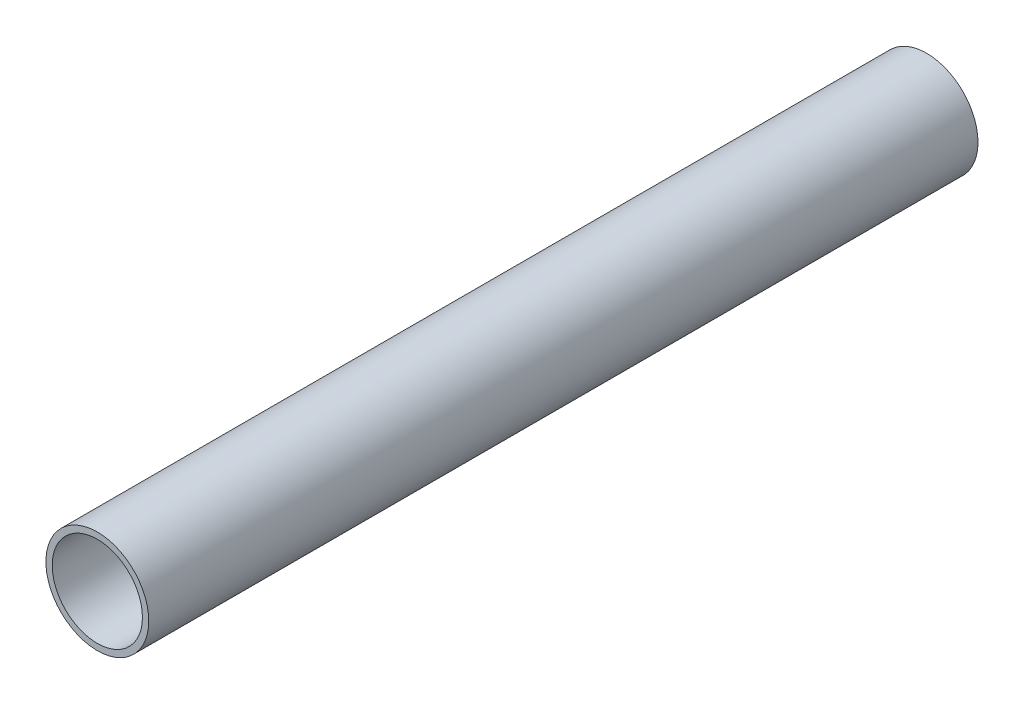
ISO-10303-21;
HEADER;
FILE_DESCRIPTION(('STEP AP214'),'2;1');
FILE_NAME('part.step','',(''),(''),'','','');
FILE_SCHEMA(('AUTOMOTIVE_DESIGN { 1 0 10303 214 1 1 1 1 }'));
ENDSEC;
DATA;
#1=APPLICATION_CONTEXT('core data for automotive mechanical design processes');
#2=APPLICATION_PROTOCOL_DEFINITION('international standard','automotive_design',2000,#1);
#3=PRODUCT_CONTEXT('',#1,'mechanical');
#4=PRODUCT('Part','Part','',(#3));
#5=PRODUCT_RELATED_PRODUCT_CATEGORY('part','',(#4));
#6=PRODUCT_DEFINITION_FORMATION('','',#4);
#7=PRODUCT_DEFINITION_CONTEXT('part definition',#1,'design');
#8=PRODUCT_DEFINITION('design','',#6,#7);
#9=PRODUCT_DEFINITION_SHAPE('','',#8);
#10=(LENGTH_UNIT() NAMED_UNIT(*) SI_UNIT(.MILLI.,.METRE.));
#11=(NAMED_UNIT(*) PLANE_ANGLE_UNIT() SI_UNIT($,.RADIAN.));
#12=(NAMED_UNIT(*) SI_UNIT($,.STERADIAN.) SOLID_ANGLE_UNIT());
#13=UNCERTAINTY_MEASURE_WITH_UNIT(LENGTH_MEASURE(1.E-05),#10,'distance_accuracy_value','');
#14=(GEOMETRIC_REPRESENTATION_CONTEXT(3) GLOBAL_UNCERTAINTY_ASSIGNED_CONTEXT((#13)) GLOBAL_UNIT_ASSIGNED_CONTEXT((#10,
#11,#12)) REPRESENTATION_CONTEXT('',''));
#15=CARTESIAN_POINT('',(0.,0.,0.));
#16=DIRECTION('',(0.,0.,1.));
#17=DIRECTION('',(1.,0.,0.));
#18=AXIS2_PLACEMENT_3D('',#15,#16,#17);
#19=CARTESIAN_POINT('',(0.,0.,25.));
#20=DIRECTION('',(0.,0.,1.));
#21=DIRECTION('',(1.,0.,0.));
#22=AXIS2_PLACEMENT_3D('',#19,#20,#21);
#23=PLANE('',#22);
#24=CARTESIAN_POINT('',(0.,0.,25.));
#25=DIRECTION('',(0.,0.,1.));
#26=DIRECTION('',(1.,0.,0.));
#27=AXIS2_PLACEMENT_3D('',#24,#25,#26);
#28=CIRCLE('',#27,3.1);
#29=CARTESIAN_POINT('',(3.1,0.,25.));
#30=VERTEX_POINT('',#29);
#31=EDGE_CURVE('E10',#30,#30,#28,.T.);
#32=ORIENTED_EDGE('',*,*,#31,.T.);
#33=EDGE_LOOP('',(#32));
#34=FACE_BOUND('',#33,.T.);
#35=CARTESIAN_POINT('',(0.,0.,25.));
#36=DIRECTION('',(0.,0.,1.));
#37=DIRECTION('',(1.,0.,0.));
#38=AXIS2_PLACEMENT_3D('',#35,#36,#37);
#39=CIRCLE('',#38,2.72);
#40=CARTESIAN_POINT('',(2.72,0.,25.));
#41=VERTEX_POINT('',#40);
#42=EDGE_CURVE('E56',#41,#41,#39,.T.);
#43=ORIENTED_EDGE('',*,*,#42,.F.);
#44=EDGE_LOOP('',(#43));
#45=FACE_BOUND('',#44,.T.);
#46=ADVANCED_FACE('F43',(#34,#45),#23,.T.);
#47=CARTESIAN_POINT('',(0.,0.,-25.));
#48=DIRECTION('',(0.,0.,1.));
#49=DIRECTION('',(1.,0.,0.));
#50=AXIS2_PLACEMENT_3D('',#47,#48,#49);
#51=PLANE('',#50);
#52=CARTESIAN_POINT('',(0.,0.,-25.));
#53=DIRECTION('',(0.,0.,1.));
#54=DIRECTION('',(1.,0.,0.));
#55=AXIS2_PLACEMENT_3D('',#52,#53,#54);
#56=CIRCLE('',#55,3.1);
#57=CARTESIAN_POINT('',(3.1,0.,-25.));
#58=VERTEX_POINT('',#57);
#59=EDGE_CURVE('E47',#58,#58,#56,.T.);
#60=ORIENTED_EDGE('',*,*,#59,.F.);
#61=EDGE_LOOP('',(#60));
#62=FACE_BOUND('',#61,.T.);
#63=CARTESIAN_POINT('',(0.,0.,-25.));
#64=DIRECTION('',(0.,0.,1.));
#65=DIRECTION('',(1.,0.,0.));
#66=AXIS2_PLACEMENT_3D('',#63,#64,#65);
#67=CIRCLE('',#66,2.72);
#68=CARTESIAN_POINT('',(2.72,0.,-25.));
#69=VERTEX_POINT('',#68);
#70=EDGE_CURVE('E58',#69,#69,#67,.T.);
#71=ORIENTED_EDGE('',*,*,#70,.T.);
#72=EDGE_LOOP('',(#71));
#73=FACE_BOUND('',#72,.T.);
#74=ADVANCED_FACE('F70',(#62,#73),#51,.F.);
#75=CARTESIAN_POINT('',(0.,0.,25.));
#76=DIRECTION('',(0.,0.,-1.));
#77=DIRECTION('',(-1.,0.,0.));
#78=AXIS2_PLACEMENT_3D('',#75,#76,#77);
#79=CYLINDRICAL_SURFACE('',#78,3.1);
#80=ORIENTED_EDGE('',*,*,#31,.F.);
#81=EDGE_LOOP('',(#80));
#82=FACE_BOUND('',#81,.T.);
#83=ORIENTED_EDGE('',*,*,#59,.T.);
#84=EDGE_LOOP('',(#83));
#85=FACE_BOUND('',#84,.T.);
#86=ADVANCED_FACE('F45',(#82,#85),#79,.T.);
#87=CARTESIAN_POINT('',(0.,0.,25.));
#88=DIRECTION('',(0.,0.,-1.));
#89=DIRECTION('',(-1.,0.,0.));
#90=AXIS2_PLACEMENT_3D('',#87,#88,#89);
#91=CYLINDRICAL_SURFACE('',#90,2.72);
#92=ORIENTED_EDGE('',*,*,#42,.T.);
#93=EDGE_LOOP('',(#92));
#94=FACE_BOUND('',#93,.T.);
#95=ORIENTED_EDGE('',*,*,#70,.F.);
#96=EDGE_LOOP('',(#95));
#97=FACE_BOUND('',#96,.T.);
#98=ADVANCED_FACE('F66',(#94,#97),#91,.F.);
#99=CLOSED_SHELL('',(#46,#74,#86,#98));
#100=MANIFOLD_SOLID_BREP('B2',#99);
#101=ADVANCED_BREP_SHAPE_REPRESENTATION('',(#18,#100),#14);
#102=SHAPE_DEFINITION_REPRESENTATION(#9,#101);
ENDSEC;
END-ISO-10303-21;
